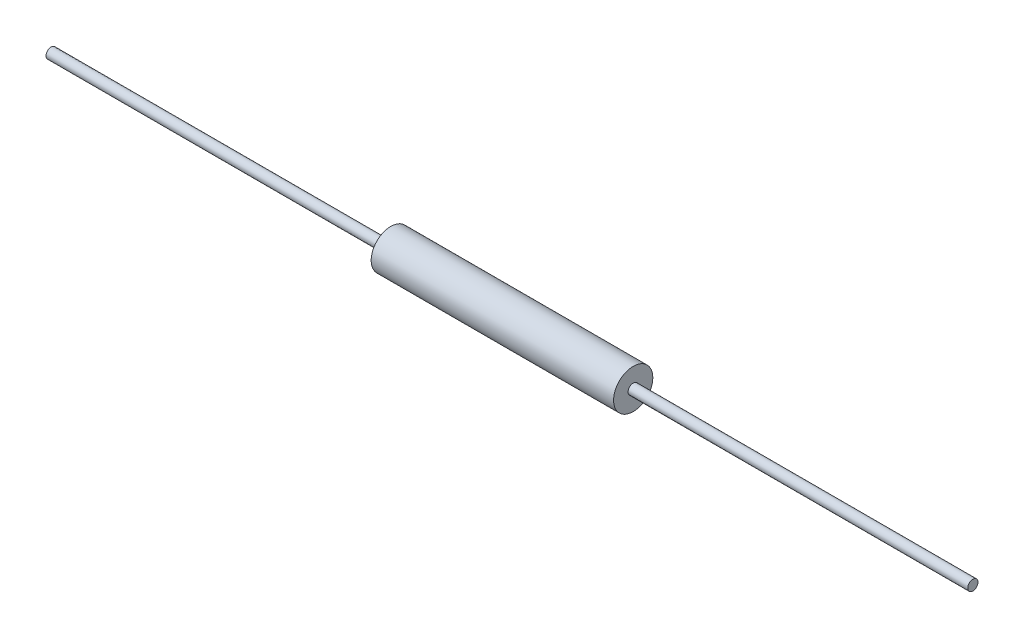
ISO-10303-21;
HEADER;
FILE_DESCRIPTION(('STEP AP214'),'2;1');
FILE_NAME('part.step','',(''),(''),'','','');
FILE_SCHEMA(('AUTOMOTIVE_DESIGN { 1 0 10303 214 1 1 1 1 }'));
ENDSEC;
DATA;
#1=APPLICATION_CONTEXT('core data for automotive mechanical design processes');
#2=APPLICATION_PROTOCOL_DEFINITION('international standard','automotive_design',2000,#1);
#3=PRODUCT_CONTEXT('',#1,'mechanical');
#4=PRODUCT('Part','Part','',(#3));
#5=PRODUCT_RELATED_PRODUCT_CATEGORY('part','',(#4));
#6=PRODUCT_DEFINITION_FORMATION('','',#4);
#7=PRODUCT_DEFINITION_CONTEXT('part definition',#1,'design');
#8=PRODUCT_DEFINITION('design','',#6,#7);
#9=PRODUCT_DEFINITION_SHAPE('','',#8);
#10=(LENGTH_UNIT() NAMED_UNIT(*) SI_UNIT(.MILLI.,.METRE.));
#11=(NAMED_UNIT(*) PLANE_ANGLE_UNIT() SI_UNIT($,.RADIAN.));
#12=(NAMED_UNIT(*) SI_UNIT($,.STERADIAN.) SOLID_ANGLE_UNIT());
#13=UNCERTAINTY_MEASURE_WITH_UNIT(LENGTH_MEASURE(1.E-05),#10,'distance_accuracy_value','');
#14=(GEOMETRIC_REPRESENTATION_CONTEXT(3) GLOBAL_UNCERTAINTY_ASSIGNED_CONTEXT((#13)) GLOBAL_UNIT_ASSIGNED_CONTEXT((#10,
#11,#12)) REPRESENTATION_CONTEXT('',''));
#15=CARTESIAN_POINT('',(0.,0.,0.));
#16=DIRECTION('',(0.,0.,1.));
#17=DIRECTION('',(1.,0.,0.));
#18=AXIS2_PLACEMENT_3D('',#15,#16,#17);
#19=CARTESIAN_POINT('',(14.2,0.,0.));
#20=DIRECTION('',(-1.,0.,0.));
#21=DIRECTION('',(0.,0.,1.));
#22=AXIS2_PLACEMENT_3D('',#19,#20,#21);
#23=CYLINDRICAL_SURFACE('',#22,1.15);
#24=CARTESIAN_POINT('',(14.2,0.,0.));
#25=DIRECTION('',(1.,0.,0.));
#26=DIRECTION('',(0.,0.,-1.));
#27=AXIS2_PLACEMENT_3D('',#24,#25,#26);
#28=CIRCLE('',#27,1.15);
#29=CARTESIAN_POINT('',(14.2,0.,-1.15));
#30=VERTEX_POINT('',#29);
#31=EDGE_CURVE('E51',#30,#30,#28,.T.);
#32=ORIENTED_EDGE('',*,*,#31,.F.);
#33=EDGE_LOOP('',(#32));
#34=FACE_BOUND('',#33,.T.);
#35=CARTESIAN_POINT('',(0.,0.,0.));
#36=DIRECTION('',(1.,0.,0.));
#37=DIRECTION('',(0.,0.,-1.));
#38=AXIS2_PLACEMENT_3D('',#35,#36,#37);
#39=CIRCLE('',#38,1.15);
#40=CARTESIAN_POINT('',(0.,0.,-1.15));
#41=VERTEX_POINT('',#40);
#42=EDGE_CURVE('E40',#41,#41,#39,.T.);
#43=ORIENTED_EDGE('',*,*,#42,.T.);
#44=EDGE_LOOP('',(#43));
#45=FACE_BOUND('',#44,.T.);
#46=ADVANCED_FACE('F37',(#34,#45),#23,.T.);
#47=CARTESIAN_POINT('',(14.2,0.,0.));
#48=DIRECTION('',(1.,0.,0.));
#49=DIRECTION('',(0.,0.,-1.));
#50=AXIS2_PLACEMENT_3D('',#47,#48,#49);
#51=PLANE('',#50);
#52=CARTESIAN_POINT('',(14.2,0.,0.));
#53=DIRECTION('',(1.,0.,0.));
#54=DIRECTION('',(0.,0.,-1.));
#55=AXIS2_PLACEMENT_3D('',#52,#53,#54);
#56=CIRCLE('',#55,0.3);
#57=CARTESIAN_POINT('',(14.2,0.,-0.3));
#58=VERTEX_POINT('',#57);
#59=EDGE_CURVE('E45',#58,#58,#56,.T.);
#60=ORIENTED_EDGE('',*,*,#59,.F.);
#61=EDGE_LOOP('',(#60));
#62=FACE_BOUND('',#61,.T.);
#63=ORIENTED_EDGE('',*,*,#31,.T.);
#64=EDGE_LOOP('',(#63));
#65=FACE_BOUND('',#64,.T.);
#66=ADVANCED_FACE('F71',(#62,#65),#51,.T.);
#67=CARTESIAN_POINT('',(0.,0.,0.));
#68=DIRECTION('',(1.,0.,0.));
#69=DIRECTION('',(0.,0.,-1.));
#70=AXIS2_PLACEMENT_3D('',#67,#68,#69);
#71=PLANE('',#70);
#72=CARTESIAN_POINT('',(0.,0.,0.));
#73=DIRECTION('',(-1.,0.,0.));
#74=DIRECTION('',(0.,0.,1.));
#75=AXIS2_PLACEMENT_3D('',#72,#73,#74);
#76=CIRCLE('',#75,0.3);
#77=CARTESIAN_POINT('',(0.,0.,0.3));
#78=VERTEX_POINT('',#77);
#79=EDGE_CURVE('E10',#78,#78,#76,.T.);
#80=ORIENTED_EDGE('',*,*,#79,.F.);
#81=EDGE_LOOP('',(#80));
#82=FACE_BOUND('',#81,.T.);
#83=ORIENTED_EDGE('',*,*,#42,.F.);
#84=EDGE_LOOP('',(#83));
#85=FACE_BOUND('',#84,.T.);
#86=ADVANCED_FACE('F68',(#82,#85),#71,.F.);
#87=CARTESIAN_POINT('',(34.1,0.,0.));
#88=DIRECTION('',(-1.,0.,0.));
#89=DIRECTION('',(0.,0.,1.));
#90=AXIS2_PLACEMENT_3D('',#87,#88,#89);
#91=CYLINDRICAL_SURFACE('',#90,0.3);
#92=CARTESIAN_POINT('',(34.1,0.,0.));
#93=DIRECTION('',(1.,0.,0.));
#94=DIRECTION('',(0.,0.,-1.));
#95=AXIS2_PLACEMENT_3D('',#92,#93,#94);
#96=CIRCLE('',#95,0.3);
#97=CARTESIAN_POINT('',(34.1,0.,-0.3));
#98=VERTEX_POINT('',#97);
#99=EDGE_CURVE('E56',#98,#98,#96,.T.);
#100=ORIENTED_EDGE('',*,*,#99,.F.);
#101=EDGE_LOOP('',(#100));
#102=FACE_BOUND('',#101,.T.);
#103=ORIENTED_EDGE('',*,*,#59,.T.);
#104=EDGE_LOOP('',(#103));
#105=FACE_BOUND('',#104,.T.);
#106=ADVANCED_FACE('F70',(#102,#105),#91,.T.);
#107=CARTESIAN_POINT('',(34.1,0.,0.));
#108=DIRECTION('',(1.,0.,0.));
#109=DIRECTION('',(0.,0.,-1.));
#110=AXIS2_PLACEMENT_3D('',#107,#108,#109);
#111=PLANE('',#110);
#112=ORIENTED_EDGE('',*,*,#99,.T.);
#113=EDGE_LOOP('',(#112));
#114=FACE_BOUND('',#113,.T.);
#115=ADVANCED_FACE('F77',(#114),#111,.T.);
#116=CARTESIAN_POINT('',(-19.9,0.,0.));
#117=DIRECTION('',(1.,0.,0.));
#118=DIRECTION('',(0.,0.,-1.));
#119=AXIS2_PLACEMENT_3D('',#116,#117,#118);
#120=CYLINDRICAL_SURFACE('',#119,0.3);
#121=CARTESIAN_POINT('',(-19.9,0.,0.));
#122=DIRECTION('',(-1.,0.,0.));
#123=DIRECTION('',(0.,0.,1.));
#124=AXIS2_PLACEMENT_3D('',#121,#122,#123);
#125=CIRCLE('',#124,0.3);
#126=CARTESIAN_POINT('',(-19.9,0.,0.3));
#127=VERTEX_POINT('',#126);
#128=EDGE_CURVE('E55',#127,#127,#125,.T.);
#129=ORIENTED_EDGE('',*,*,#128,.F.);
#130=EDGE_LOOP('',(#129));
#131=FACE_BOUND('',#130,.T.);
#132=ORIENTED_EDGE('',*,*,#79,.T.);
#133=EDGE_LOOP('',(#132));
#134=FACE_BOUND('',#133,.T.);
#135=ADVANCED_FACE('F105',(#131,#134),#120,.T.);
#136=CARTESIAN_POINT('',(-19.9,0.,0.));
#137=DIRECTION('',(-1.,0.,0.));
#138=DIRECTION('',(0.,0.,1.));
#139=AXIS2_PLACEMENT_3D('',#136,#137,#138);
#140=PLANE('',#139);
#141=ORIENTED_EDGE('',*,*,#128,.T.);
#142=EDGE_LOOP('',(#141));
#143=FACE_BOUND('',#142,.T.);
#144=ADVANCED_FACE('F119',(#143),#140,.T.);
#145=CLOSED_SHELL('',(#46,#66,#86,#106,#115,#135,#144));
#146=MANIFOLD_SOLID_BREP('B2',#145);
#147=ADVANCED_BREP_SHAPE_REPRESENTATION('',(#18,#146),#14);
#148=SHAPE_DEFINITION_REPRESENTATION(#9,#147);
ENDSEC;
END-ISO-10303-21;
